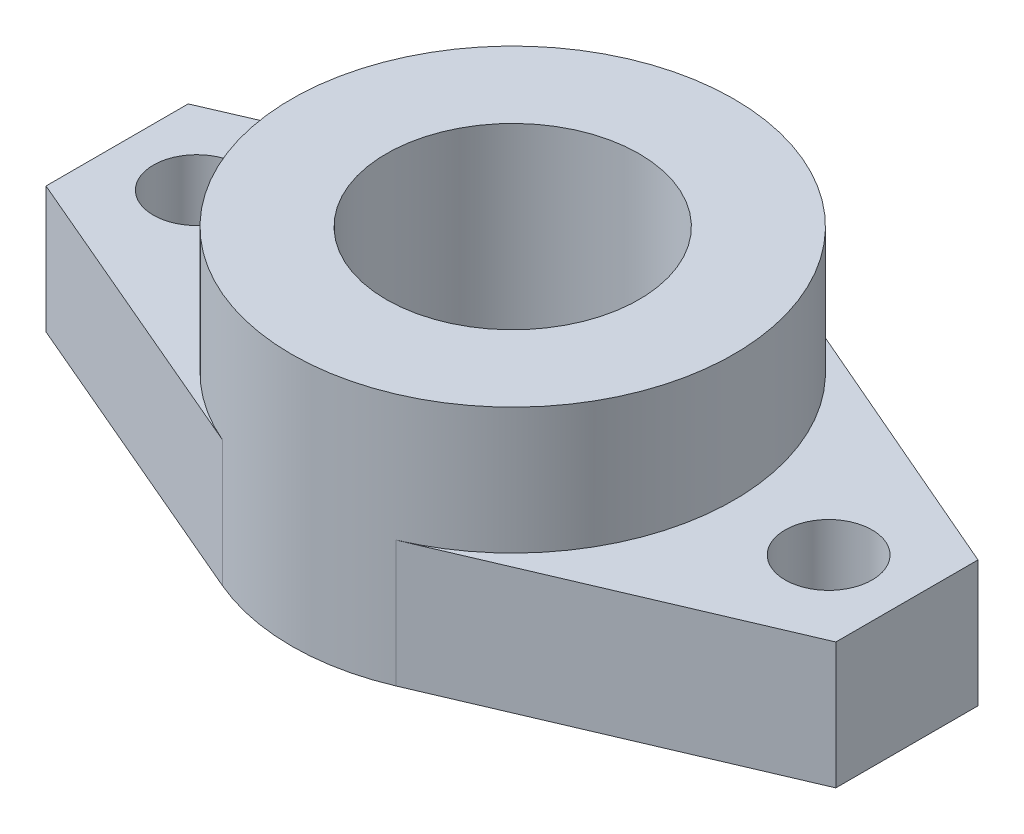
ISO-10303-21;
HEADER;
FILE_DESCRIPTION(('STEP AP214'),'2;1');
FILE_NAME('part.step','',(''),(''),'','','');
FILE_SCHEMA(('AUTOMOTIVE_DESIGN { 1 0 10303 214 1 1 1 1 }'));
ENDSEC;
DATA;
#1=APPLICATION_CONTEXT('core data for automotive mechanical design processes');
#2=APPLICATION_PROTOCOL_DEFINITION('international standard','automotive_design',2000,#1);
#3=PRODUCT_CONTEXT('',#1,'mechanical');
#4=PRODUCT('Part','Part','',(#3));
#5=PRODUCT_RELATED_PRODUCT_CATEGORY('part','',(#4));
#6=PRODUCT_DEFINITION_FORMATION('','',#4);
#7=PRODUCT_DEFINITION_CONTEXT('part definition',#1,'design');
#8=PRODUCT_DEFINITION('design','',#6,#7);
#9=PRODUCT_DEFINITION_SHAPE('','',#8);
#10=(LENGTH_UNIT() NAMED_UNIT(*) SI_UNIT(.MILLI.,.METRE.));
#11=(NAMED_UNIT(*) PLANE_ANGLE_UNIT() SI_UNIT($,.RADIAN.));
#12=(NAMED_UNIT(*) SI_UNIT($,.STERADIAN.) SOLID_ANGLE_UNIT());
#13=UNCERTAINTY_MEASURE_WITH_UNIT(LENGTH_MEASURE(1.E-05),#10,'distance_accuracy_value','');
#14=(GEOMETRIC_REPRESENTATION_CONTEXT(3) GLOBAL_UNCERTAINTY_ASSIGNED_CONTEXT((#13)) GLOBAL_UNIT_ASSIGNED_CONTEXT((#10,
#11,#12)) REPRESENTATION_CONTEXT('',''));
#15=CARTESIAN_POINT('',(0.,0.,0.));
#16=DIRECTION('',(0.,0.,1.));
#17=DIRECTION('',(1.,0.,0.));
#18=AXIS2_PLACEMENT_3D('',#15,#16,#17);
#19=CARTESIAN_POINT('',(0.,8.,0.));
#20=DIRECTION('',(0.,1.,0.));
#21=DIRECTION('',(0.,0.,1.));
#22=AXIS2_PLACEMENT_3D('',#19,#20,#21);
#23=PLANE('',#22);
#24=CARTESIAN_POINT('',(20.,8.,0.));
#25=DIRECTION('',(0.,1.,0.));
#26=DIRECTION('',(0.,0.,1.));
#27=AXIS2_PLACEMENT_3D('',#24,#25,#26);
#28=CIRCLE('',#27,2.74999999999999);
#29=CARTESIAN_POINT('',(20.,8.,2.74999999999999));
#30=VERTEX_POINT('',#29);
#31=EDGE_CURVE('E213',#30,#30,#28,.T.);
#32=ORIENTED_EDGE('',*,*,#31,.F.);
#33=EDGE_LOOP('',(#32));
#34=FACE_BOUND('',#33,.T.);
#35=CARTESIAN_POINT('',(0.,8.,0.));
#36=DIRECTION('',(0.,1.,0.));
#37=DIRECTION('',(0.,0.,1.));
#38=AXIS2_PLACEMENT_3D('',#35,#36,#37);
#39=CIRCLE('',#38,14.);
#40=CARTESIAN_POINT('',(5.49928223328353,8.,12.8746997991678));
#41=VERTEX_POINT('',#40);
#42=CARTESIAN_POINT('',(5.54968279191149,8.,-12.8530549251593));
#43=VERTEX_POINT('',#42);
#44=EDGE_CURVE('E142',#41,#43,#39,.T.);
#45=ORIENTED_EDGE('',*,*,#44,.F.);
#46=DIRECTION('',(0.919621414226274,0.,-0.392805873805966));
#47=VECTOR('',#46,1.);
#48=CARTESIAN_POINT('',(25.,8.,4.54518902038356));
#49=LINE('',#48,#47);
#50=CARTESIAN_POINT('',(25.,8.,4.54518902038356));
#51=VERTEX_POINT('',#50);
#52=EDGE_CURVE('E117',#41,#51,#49,.T.);
#53=ORIENTED_EDGE('',*,*,#52,.T.);
#54=DIRECTION('',(0.,0.,-1.));
#55=VECTOR('',#54,1.);
#56=CARTESIAN_POINT('',(25.,8.,-4.45481097961644));
#57=LINE('',#56,#55);
#58=CARTESIAN_POINT('',(25.,8.,-4.45481097961644));
#59=VERTEX_POINT('',#58);
#60=EDGE_CURVE('E111',#51,#59,#57,.T.);
#61=ORIENTED_EDGE('',*,*,#60,.T.);
#62=DIRECTION('',(-0.918075351797092,0.,-0.396405913707963));
#63=VECTOR('',#62,1.);
#64=CARTESIAN_POINT('',(25.,8.,-4.45481097961644));
#65=LINE('',#64,#63);
#66=EDGE_CURVE('E115',#59,#43,#65,.T.);
#67=ORIENTED_EDGE('',*,*,#66,.T.);
#68=EDGE_LOOP('',(#45,#53,#61,#67));
#69=FACE_BOUND('',#68,.T.);
#70=ADVANCED_FACE('F37',(#34,#69),#23,.T.);
#71=CARTESIAN_POINT('',(-20.,8.,0.));
#72=DIRECTION('',(0.,1.,0.));
#73=DIRECTION('',(0.,0.,1.));
#74=AXIS2_PLACEMENT_3D('',#71,#72,#73);
#75=CIRCLE('',#74,2.74999999999999);
#76=CARTESIAN_POINT('',(-20.,8.,2.74999999999999));
#77=VERTEX_POINT('',#76);
#78=EDGE_CURVE('E219',#77,#77,#75,.T.);
#79=ORIENTED_EDGE('',*,*,#78,.F.);
#80=EDGE_LOOP('',(#79));
#81=FACE_BOUND('',#80,.T.);
#82=CARTESIAN_POINT('',(-5.54968279191149,8.,-12.8530549251593));
#83=VERTEX_POINT('',#82);
#84=CARTESIAN_POINT('',(-5.49928223328352,8.,12.8746997991678));
#85=VERTEX_POINT('',#84);
#86=EDGE_CURVE('E11',#83,#85,#39,.T.);
#87=ORIENTED_EDGE('',*,*,#86,.F.);
#88=DIRECTION('',(-0.918075351797092,0.,0.396405913707963));
#89=VECTOR('',#88,1.);
#90=CARTESIAN_POINT('',(-25.,8.,-4.45481097961644));
#91=LINE('',#90,#89);
#92=CARTESIAN_POINT('',(-25.,8.,-4.45481097961644));
#93=VERTEX_POINT('',#92);
#94=EDGE_CURVE('E149',#83,#93,#91,.T.);
#95=ORIENTED_EDGE('',*,*,#94,.T.);
#96=DIRECTION('',(0.,0.,1.));
#97=VECTOR('',#96,1.);
#98=CARTESIAN_POINT('',(-25.,8.,-4.45481097961644));
#99=LINE('',#98,#97);
#100=CARTESIAN_POINT('',(-25.,8.,4.54518902038356));
#101=VERTEX_POINT('',#100);
#102=EDGE_CURVE('E100',#93,#101,#99,.T.);
#103=ORIENTED_EDGE('',*,*,#102,.T.);
#104=DIRECTION('',(0.919621414226274,0.,0.392805873805966));
#105=VECTOR('',#104,1.);
#106=CARTESIAN_POINT('',(-25.,8.,4.54518902038356));
#107=LINE('',#106,#105);
#108=EDGE_CURVE('E172',#101,#85,#107,.T.);
#109=ORIENTED_EDGE('',*,*,#108,.T.);
#110=EDGE_LOOP('',(#87,#95,#103,#109));
#111=FACE_BOUND('',#110,.T.);
#112=ADVANCED_FACE('F225',(#81,#111),#23,.T.);
#113=CARTESIAN_POINT('',(0.,0.,0.));
#114=DIRECTION('',(0.,1.,0.));
#115=DIRECTION('',(0.,0.,1.));
#116=AXIS2_PLACEMENT_3D('',#113,#114,#115);
#117=PLANE('',#116);
#118=CARTESIAN_POINT('',(-20.,0.,0.));
#119=DIRECTION('',(0.,1.,0.));
#120=DIRECTION('',(0.,0.,1.));
#121=AXIS2_PLACEMENT_3D('',#118,#119,#120);
#122=CIRCLE('',#121,2.75);
#123=CARTESIAN_POINT('',(-20.,0.,2.75));
#124=VERTEX_POINT('',#123);
#125=EDGE_CURVE('E216',#124,#124,#122,.T.);
#126=ORIENTED_EDGE('',*,*,#125,.T.);
#127=EDGE_LOOP('',(#126));
#128=FACE_BOUND('',#127,.T.);
#129=CARTESIAN_POINT('',(20.,0.,0.));
#130=DIRECTION('',(0.,1.,0.));
#131=DIRECTION('',(0.,0.,1.));
#132=AXIS2_PLACEMENT_3D('',#129,#130,#131);
#133=CIRCLE('',#132,2.75);
#134=CARTESIAN_POINT('',(20.,0.,2.75));
#135=VERTEX_POINT('',#134);
#136=EDGE_CURVE('E210',#135,#135,#133,.T.);
#137=ORIENTED_EDGE('',*,*,#136,.T.);
#138=EDGE_LOOP('',(#137));
#139=FACE_BOUND('',#138,.T.);
#140=DIRECTION('',(-0.918075351797092,0.,0.396405913707963));
#141=VECTOR('',#140,1.);
#142=CARTESIAN_POINT('',(-25.,0.,-4.45481097961644));
#143=LINE('',#142,#141);
#144=CARTESIAN_POINT('',(-5.54968279191149,0.,-12.8530549251593));
#145=VERTEX_POINT('',#144);
#146=CARTESIAN_POINT('',(-25.,0.,-4.45481097961644));
#147=VERTEX_POINT('',#146);
#148=EDGE_CURVE('E148',#145,#147,#143,.T.);
#149=ORIENTED_EDGE('',*,*,#148,.F.);
#150=CARTESIAN_POINT('',(0.,0.,0.));
#151=DIRECTION('',(0.,1.,0.));
#152=DIRECTION('',(0.,0.,1.));
#153=AXIS2_PLACEMENT_3D('',#150,#151,#152);
#154=CIRCLE('',#153,14.);
#155=CARTESIAN_POINT('',(5.54968279191149,0.,-12.8530549251593));
#156=VERTEX_POINT('',#155);
#157=EDGE_CURVE('E91',#156,#145,#154,.T.);
#158=ORIENTED_EDGE('',*,*,#157,.F.);
#159=DIRECTION('',(-0.918075351797092,0.,-0.396405913707963));
#160=VECTOR('',#159,1.);
#161=CARTESIAN_POINT('',(25.,0.,-4.45481097961644));
#162=LINE('',#161,#160);
#163=CARTESIAN_POINT('',(25.,0.,-4.45481097961644));
#164=VERTEX_POINT('',#163);
#165=EDGE_CURVE('E85',#164,#156,#162,.T.);
#166=ORIENTED_EDGE('',*,*,#165,.F.);
#167=DIRECTION('',(0.,0.,-1.));
#168=VECTOR('',#167,1.);
#169=CARTESIAN_POINT('',(25.,0.,-4.45481097961644));
#170=LINE('',#169,#168);
#171=CARTESIAN_POINT('',(25.,0.,4.54518902038356));
#172=VERTEX_POINT('',#171);
#173=EDGE_CURVE('E125',#172,#164,#170,.T.);
#174=ORIENTED_EDGE('',*,*,#173,.F.);
#175=DIRECTION('',(0.919621414226274,0.,-0.392805873805966));
#176=VECTOR('',#175,1.);
#177=CARTESIAN_POINT('',(25.,0.,4.54518902038356));
#178=LINE('',#177,#176);
#179=CARTESIAN_POINT('',(5.49928223328353,0.,12.8746997991678));
#180=VERTEX_POINT('',#179);
#181=EDGE_CURVE('E188',#180,#172,#178,.T.);
#182=ORIENTED_EDGE('',*,*,#181,.F.);
#183=CARTESIAN_POINT('',(0.,0.,0.));
#184=DIRECTION('',(0.,1.,0.));
#185=DIRECTION('',(0.,0.,1.));
#186=AXIS2_PLACEMENT_3D('',#183,#184,#185);
#187=CIRCLE('',#186,14.);
#188=CARTESIAN_POINT('',(-5.49928223328352,0.,12.8746997991678));
#189=VERTEX_POINT('',#188);
#190=EDGE_CURVE('E190',#189,#180,#187,.T.);
#191=ORIENTED_EDGE('',*,*,#190,.F.);
#192=DIRECTION('',(0.919621414226274,0.,0.392805873805966));
#193=VECTOR('',#192,1.);
#194=CARTESIAN_POINT('',(-25.,0.,4.54518902038356));
#195=LINE('',#194,#193);
#196=CARTESIAN_POINT('',(-25.,0.,4.54518902038356));
#197=VERTEX_POINT('',#196);
#198=EDGE_CURVE('E192',#197,#189,#195,.T.);
#199=ORIENTED_EDGE('',*,*,#198,.F.);
#200=DIRECTION('',(0.,0.,1.));
#201=VECTOR('',#200,1.);
#202=CARTESIAN_POINT('',(-25.,0.,-4.45481097961644));
#203=LINE('',#202,#201);
#204=EDGE_CURVE('E196',#147,#197,#203,.T.);
#205=ORIENTED_EDGE('',*,*,#204,.F.);
#206=EDGE_LOOP('',(#149,#158,#166,#174,#182,#191,#199,#205));
#207=FACE_BOUND('',#206,.T.);
#208=CARTESIAN_POINT('',(0.,0.,0.));
#209=DIRECTION('',(0.,1.,0.));
#210=DIRECTION('',(0.,0.,1.));
#211=AXIS2_PLACEMENT_3D('',#208,#209,#210);
#212=CIRCLE('',#211,8.);
#213=CARTESIAN_POINT('',(0.,0.,8.));
#214=VERTEX_POINT('',#213);
#215=EDGE_CURVE('E198',#214,#214,#212,.T.);
#216=ORIENTED_EDGE('',*,*,#215,.T.);
#217=EDGE_LOOP('',(#216));
#218=FACE_BOUND('',#217,.T.);
#219=ADVANCED_FACE('F145',(#128,#139,#207,#218),#117,.F.);
#220=CARTESIAN_POINT('',(-25.,8.,-4.45481097961644));
#221=DIRECTION('',(0.396405913707963,0.,0.918075351797092));
#222=DIRECTION('',(0.918075351797092,0.,-0.396405913707963));
#223=AXIS2_PLACEMENT_3D('',#220,#221,#222);
#224=PLANE('',#223);
#225=ORIENTED_EDGE('',*,*,#148,.T.);
#226=DIRECTION('',(0.,-1.,0.));
#227=VECTOR('',#226,1.);
#228=CARTESIAN_POINT('',(-25.,8.,-4.45481097961644));
#229=LINE('',#228,#227);
#230=EDGE_CURVE('E47',#93,#147,#229,.T.);
#231=ORIENTED_EDGE('',*,*,#230,.F.);
#232=ORIENTED_EDGE('',*,*,#94,.F.);
#233=DIRECTION('',(0.,-1.,0.));
#234=VECTOR('',#233,1.);
#235=CARTESIAN_POINT('',(-5.54968279191149,8.,-12.8530549251593));
#236=LINE('',#235,#234);
#237=EDGE_CURVE('E131',#83,#145,#236,.T.);
#238=ORIENTED_EDGE('',*,*,#237,.T.);
#239=EDGE_LOOP('',(#225,#231,#232,#238));
#240=FACE_BOUND('',#239,.T.);
#241=ADVANCED_FACE('F39',(#240),#224,.F.);
#242=CARTESIAN_POINT('',(-25.,8.,-4.45481097961644));
#243=DIRECTION('',(1.,0.,0.));
#244=DIRECTION('',(0.,0.,-1.));
#245=AXIS2_PLACEMENT_3D('',#242,#243,#244);
#246=PLANE('',#245);
#247=ORIENTED_EDGE('',*,*,#204,.T.);
#248=DIRECTION('',(0.,-1.,0.));
#249=VECTOR('',#248,1.);
#250=CARTESIAN_POINT('',(-25.,8.,4.54518902038356));
#251=LINE('',#250,#249);
#252=EDGE_CURVE('E156',#101,#197,#251,.T.);
#253=ORIENTED_EDGE('',*,*,#252,.F.);
#254=ORIENTED_EDGE('',*,*,#102,.F.);
#255=ORIENTED_EDGE('',*,*,#230,.T.);
#256=EDGE_LOOP('',(#247,#253,#254,#255));
#257=FACE_BOUND('',#256,.T.);
#258=ADVANCED_FACE('F249',(#257),#246,.F.);
#259=CARTESIAN_POINT('',(-25.,8.,4.54518902038356));
#260=DIRECTION('',(0.392805873805966,0.,-0.919621414226274));
#261=DIRECTION('',(-0.919621414226274,0.,-0.392805873805966));
#262=AXIS2_PLACEMENT_3D('',#259,#260,#261);
#263=PLANE('',#262);
#264=ORIENTED_EDGE('',*,*,#198,.T.);
#265=DIRECTION('',(0.,-1.,0.));
#266=VECTOR('',#265,1.);
#267=CARTESIAN_POINT('',(-5.49928223328352,8.,12.8746997991678));
#268=LINE('',#267,#266);
#269=EDGE_CURVE('E159',#85,#189,#268,.T.);
#270=ORIENTED_EDGE('',*,*,#269,.F.);
#271=ORIENTED_EDGE('',*,*,#108,.F.);
#272=ORIENTED_EDGE('',*,*,#252,.T.);
#273=EDGE_LOOP('',(#264,#270,#271,#272));
#274=FACE_BOUND('',#273,.T.);
#275=ADVANCED_FACE('F247',(#274),#263,.F.);
#276=CARTESIAN_POINT('',(25.,8.,4.54518902038356));
#277=DIRECTION('',(-0.392805873805966,0.,-0.919621414226274));
#278=DIRECTION('',(-0.919621414226274,0.,0.392805873805966));
#279=AXIS2_PLACEMENT_3D('',#276,#277,#278);
#280=PLANE('',#279);
#281=ORIENTED_EDGE('',*,*,#181,.T.);
#282=DIRECTION('',(0.,-1.,0.));
#283=VECTOR('',#282,1.);
#284=CARTESIAN_POINT('',(25.,8.,4.54518902038356));
#285=LINE('',#284,#283);
#286=EDGE_CURVE('E126',#51,#172,#285,.T.);
#287=ORIENTED_EDGE('',*,*,#286,.F.);
#288=ORIENTED_EDGE('',*,*,#52,.F.);
#289=DIRECTION('',(0.,-1.,0.));
#290=VECTOR('',#289,1.);
#291=CARTESIAN_POINT('',(5.49928223328353,8.,12.8746997991678));
#292=LINE('',#291,#290);
#293=EDGE_CURVE('E155',#41,#180,#292,.T.);
#294=ORIENTED_EDGE('',*,*,#293,.T.);
#295=EDGE_LOOP('',(#281,#287,#288,#294));
#296=FACE_BOUND('',#295,.T.);
#297=ADVANCED_FACE('F187',(#296),#280,.F.);
#298=CARTESIAN_POINT('',(25.,8.,-4.45481097961644));
#299=DIRECTION('',(-1.,0.,0.));
#300=DIRECTION('',(0.,0.,1.));
#301=AXIS2_PLACEMENT_3D('',#298,#299,#300);
#302=PLANE('',#301);
#303=ORIENTED_EDGE('',*,*,#173,.T.);
#304=DIRECTION('',(0.,-1.,0.));
#305=VECTOR('',#304,1.);
#306=CARTESIAN_POINT('',(25.,8.,-4.45481097961644));
#307=LINE('',#306,#305);
#308=EDGE_CURVE('E122',#59,#164,#307,.T.);
#309=ORIENTED_EDGE('',*,*,#308,.F.);
#310=ORIENTED_EDGE('',*,*,#60,.F.);
#311=ORIENTED_EDGE('',*,*,#286,.T.);
#312=EDGE_LOOP('',(#303,#309,#310,#311));
#313=FACE_BOUND('',#312,.T.);
#314=ADVANCED_FACE('F123',(#313),#302,.F.);
#315=CARTESIAN_POINT('',(25.,8.,-4.45481097961644));
#316=DIRECTION('',(-0.396405913707963,0.,0.918075351797092));
#317=DIRECTION('',(0.918075351797092,0.,0.396405913707963));
#318=AXIS2_PLACEMENT_3D('',#315,#316,#317);
#319=PLANE('',#318);
#320=ORIENTED_EDGE('',*,*,#165,.T.);
#321=DIRECTION('',(0.,-1.,0.));
#322=VECTOR('',#321,1.);
#323=CARTESIAN_POINT('',(5.54968279191149,8.,-12.8530549251593));
#324=LINE('',#323,#322);
#325=EDGE_CURVE('E127',#43,#156,#324,.T.);
#326=ORIENTED_EDGE('',*,*,#325,.F.);
#327=ORIENTED_EDGE('',*,*,#66,.F.);
#328=ORIENTED_EDGE('',*,*,#308,.T.);
#329=EDGE_LOOP('',(#320,#326,#327,#328));
#330=FACE_BOUND('',#329,.T.);
#331=ADVANCED_FACE('F129',(#330),#319,.F.);
#332=CARTESIAN_POINT('',(0.,8.,0.));
#333=DIRECTION('',(0.,-1.,0.));
#334=DIRECTION('',(0.,0.,-1.));
#335=AXIS2_PLACEMENT_3D('',#332,#333,#334);
#336=CYLINDRICAL_SURFACE('',#335,14.);
#337=ORIENTED_EDGE('',*,*,#157,.T.);
#338=ORIENTED_EDGE('',*,*,#237,.F.);
#339=ORIENTED_EDGE('',*,*,#86,.T.);
#340=ORIENTED_EDGE('',*,*,#269,.T.);
#341=ORIENTED_EDGE('',*,*,#190,.T.);
#342=ORIENTED_EDGE('',*,*,#293,.F.);
#343=ORIENTED_EDGE('',*,*,#44,.T.);
#344=ORIENTED_EDGE('',*,*,#325,.T.);
#345=EDGE_LOOP('',(#337,#338,#339,#340,#341,#342,#343,#344));
#346=FACE_BOUND('',#345,.T.);
#347=CARTESIAN_POINT('',(0.,16.,0.));
#348=DIRECTION('',(0.,1.,0.));
#349=DIRECTION('',(0.,0.,1.));
#350=AXIS2_PLACEMENT_3D('',#347,#348,#349);
#351=CIRCLE('',#350,14.);
#352=CARTESIAN_POINT('',(0.,16.,14.));
#353=VERTEX_POINT('',#352);
#354=EDGE_CURVE('E201',#353,#353,#351,.T.);
#355=ORIENTED_EDGE('',*,*,#354,.F.);
#356=EDGE_LOOP('',(#355));
#357=FACE_BOUND('',#356,.T.);
#358=ADVANCED_FACE('F139',(#346,#357),#336,.T.);
#359=CARTESIAN_POINT('',(0.,8.,0.));
#360=DIRECTION('',(0.,-1.,0.));
#361=DIRECTION('',(0.,0.,-1.));
#362=AXIS2_PLACEMENT_3D('',#359,#360,#361);
#363=CYLINDRICAL_SURFACE('',#362,8.);
#364=ORIENTED_EDGE('',*,*,#215,.F.);
#365=EDGE_LOOP('',(#364));
#366=FACE_BOUND('',#365,.T.);
#367=CARTESIAN_POINT('',(0.,16.,0.));
#368=DIRECTION('',(0.,1.,0.));
#369=DIRECTION('',(0.,0.,1.));
#370=AXIS2_PLACEMENT_3D('',#367,#368,#369);
#371=CIRCLE('',#370,8.);
#372=CARTESIAN_POINT('',(0.,16.,8.));
#373=VERTEX_POINT('',#372);
#374=EDGE_CURVE('E206',#373,#373,#371,.T.);
#375=ORIENTED_EDGE('',*,*,#374,.T.);
#376=EDGE_LOOP('',(#375));
#377=FACE_BOUND('',#376,.T.);
#378=ADVANCED_FACE('F236',(#366,#377),#363,.F.);
#379=CARTESIAN_POINT('',(0.,16.,0.));
#380=DIRECTION('',(0.,1.,0.));
#381=DIRECTION('',(0.,0.,1.));
#382=AXIS2_PLACEMENT_3D('',#379,#380,#381);
#383=PLANE('',#382);
#384=ORIENTED_EDGE('',*,*,#354,.T.);
#385=EDGE_LOOP('',(#384));
#386=FACE_BOUND('',#385,.T.);
#387=ORIENTED_EDGE('',*,*,#374,.F.);
#388=EDGE_LOOP('',(#387));
#389=FACE_BOUND('',#388,.T.);
#390=ADVANCED_FACE('F280',(#386,#389),#383,.T.);
#391=CARTESIAN_POINT('',(20.,8.,0.));
#392=DIRECTION('',(0.,1.,0.));
#393=DIRECTION('',(0.,0.,1.));
#394=AXIS2_PLACEMENT_3D('',#391,#392,#393);
#395=CYLINDRICAL_SURFACE('',#394,2.75);
#396=ORIENTED_EDGE('',*,*,#136,.F.);
#397=EDGE_LOOP('',(#396));
#398=FACE_BOUND('',#397,.T.);
#399=ORIENTED_EDGE('',*,*,#31,.T.);
#400=EDGE_LOOP('',(#399));
#401=FACE_BOUND('',#400,.T.);
#402=ADVANCED_FACE('F275',(#398,#401),#395,.F.);
#403=CARTESIAN_POINT('',(-20.,8.,0.));
#404=DIRECTION('',(0.,1.,0.));
#405=DIRECTION('',(0.,0.,1.));
#406=AXIS2_PLACEMENT_3D('',#403,#404,#405);
#407=CYLINDRICAL_SURFACE('',#406,2.75);
#408=ORIENTED_EDGE('',*,*,#125,.F.);
#409=EDGE_LOOP('',(#408));
#410=FACE_BOUND('',#409,.T.);
#411=ORIENTED_EDGE('',*,*,#78,.T.);
#412=EDGE_LOOP('',(#411));
#413=FACE_BOUND('',#412,.T.);
#414=ADVANCED_FACE('F223',(#410,#413),#407,.F.);
#415=CLOSED_SHELL('',(#70,#112,#219,#241,#258,#275,#297,#314,#331,#358,#378,#390,#402,#414));
#416=MANIFOLD_SOLID_BREP('B2',#415);
#417=ADVANCED_BREP_SHAPE_REPRESENTATION('',(#18,#416),#14);
#418=SHAPE_DEFINITION_REPRESENTATION(#9,#417);
ENDSEC;
END-ISO-10303-21;
